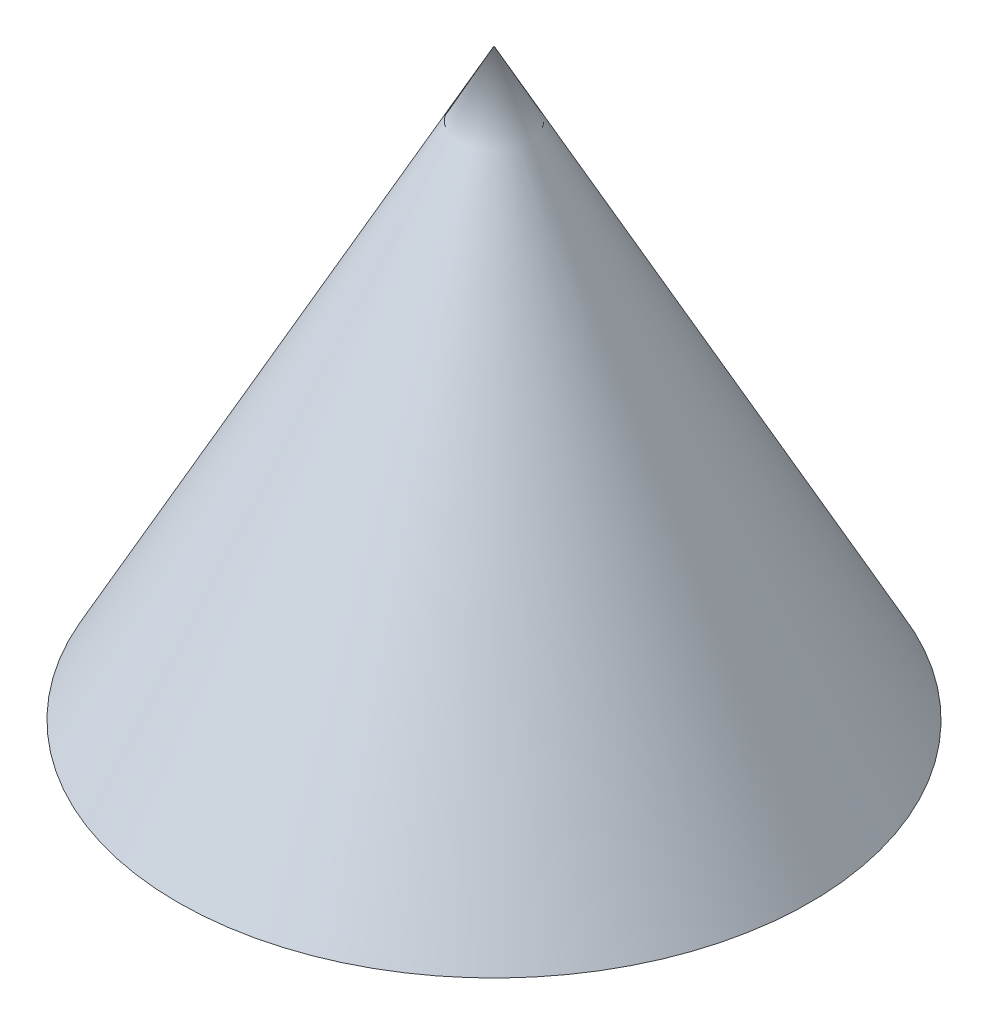
ISO-10303-21;
HEADER;
FILE_DESCRIPTION(('STEP AP214'),'2;1');
FILE_NAME('part.step','',(''),(''),'','','');
FILE_SCHEMA(('AUTOMOTIVE_DESIGN { 1 0 10303 214 1 1 1 1 }'));
ENDSEC;
DATA;
#1=APPLICATION_CONTEXT('core data for automotive mechanical design processes');
#2=APPLICATION_PROTOCOL_DEFINITION('international standard','automotive_design',2000,#1);
#3=PRODUCT_CONTEXT('',#1,'mechanical');
#4=PRODUCT('Part','Part','',(#3));
#5=PRODUCT_RELATED_PRODUCT_CATEGORY('part','',(#4));
#6=PRODUCT_DEFINITION_FORMATION('','',#4);
#7=PRODUCT_DEFINITION_CONTEXT('part definition',#1,'design');
#8=PRODUCT_DEFINITION('design','',#6,#7);
#9=PRODUCT_DEFINITION_SHAPE('','',#8);
#10=(LENGTH_UNIT() NAMED_UNIT(*) SI_UNIT(.MILLI.,.METRE.));
#11=(NAMED_UNIT(*) PLANE_ANGLE_UNIT() SI_UNIT($,.RADIAN.));
#12=(NAMED_UNIT(*) SI_UNIT($,.STERADIAN.) SOLID_ANGLE_UNIT());
#13=UNCERTAINTY_MEASURE_WITH_UNIT(LENGTH_MEASURE(1.E-05),#10,'distance_accuracy_value','');
#14=(GEOMETRIC_REPRESENTATION_CONTEXT(3) GLOBAL_UNCERTAINTY_ASSIGNED_CONTEXT((#13)) GLOBAL_UNIT_ASSIGNED_CONTEXT((#10,
#11,#12)) REPRESENTATION_CONTEXT('',''));
#15=CARTESIAN_POINT('',(0.,0.,0.));
#16=DIRECTION('',(0.,0.,1.));
#17=DIRECTION('',(1.,0.,0.));
#18=AXIS2_PLACEMENT_3D('',#15,#16,#17);
#19=CARTESIAN_POINT('',(-3.25,0.,0.));
#20=DIRECTION('',(0.,1.,0.));
#21=DIRECTION('',(0.,0.,1.));
#22=AXIS2_PLACEMENT_3D('',#19,#20,#21);
#23=PLANE('',#22);
#24=CARTESIAN_POINT('',(0.,0.,0.));
#25=DIRECTION('',(0.,-1.,0.));
#26=DIRECTION('',(0.,0.,-1.));
#27=AXIS2_PLACEMENT_3D('',#24,#25,#26);
#28=CIRCLE('',#27,3.25);
#29=CARTESIAN_POINT('',(0.,0.,-3.25));
#30=VERTEX_POINT('',#29);
#31=EDGE_CURVE('E11',#30,#30,#28,.T.);
#32=ORIENTED_EDGE('',*,*,#31,.T.);
#33=EDGE_LOOP('',(#32));
#34=FACE_BOUND('',#33,.T.);
#35=ADVANCED_FACE('F33',(#34),#23,.F.);
#36=CARTESIAN_POINT('',(0.,6.,0.));
#37=DIRECTION('',(0.,-1.,0.));
#38=DIRECTION('',(0.,0.,-1.));
#39=AXIS2_PLACEMENT_3D('',#36,#37,#38);
#40=CONICAL_SURFACE('',#39,0.,0.496422753404882);
#41=ORIENTED_EDGE('',*,*,#31,.F.);
#42=EDGE_LOOP('',(#41));
#43=FACE_BOUND('',#42,.T.);
#44=CARTESIAN_POINT('',(0.,6.,0.));
#45=VERTEX_POINT('',#44);
#46=VERTEX_LOOP('',#45);
#47=FACE_BOUND('',#46,.T.);
#48=ADVANCED_FACE('F40',(#43,#47),#40,.T.);
#49=CLOSED_SHELL('',(#35,#48));
#50=MANIFOLD_SOLID_BREP('B2',#49);
#51=ADVANCED_BREP_SHAPE_REPRESENTATION('',(#18,#50),#14);
#52=SHAPE_DEFINITION_REPRESENTATION(#9,#51);
ENDSEC;
END-ISO-10303-21;
